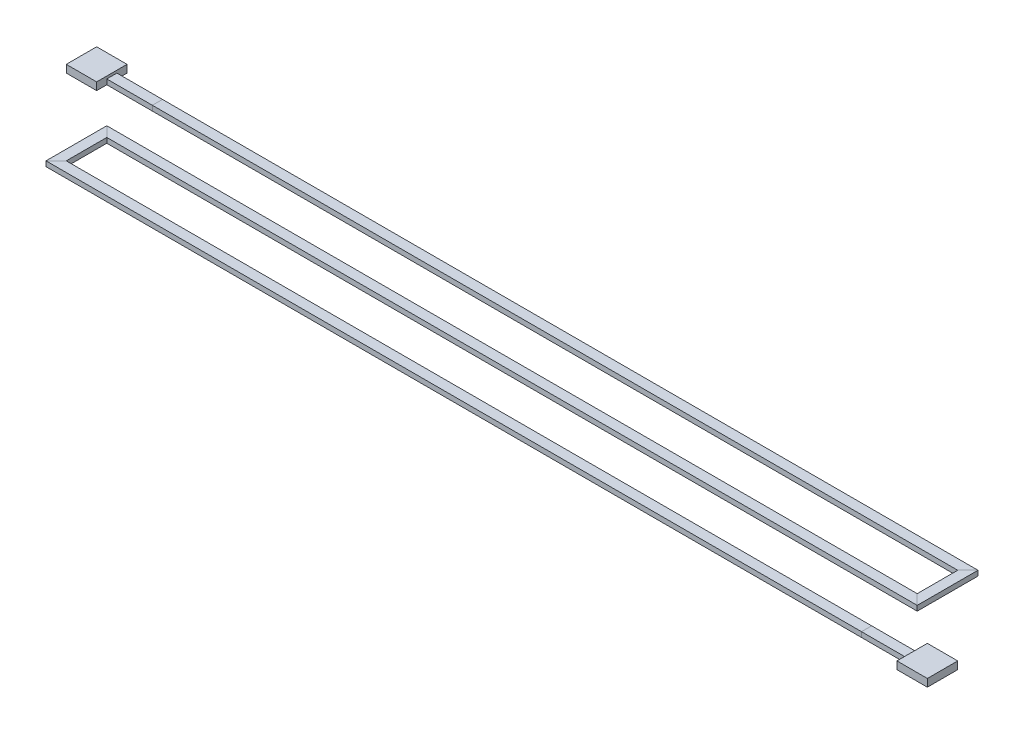
ISO-10303-21;
HEADER;
FILE_DESCRIPTION(('STEP AP214'),'2;1');
FILE_NAME('part.step','',(''),(''),'','','');
FILE_SCHEMA(('AUTOMOTIVE_DESIGN { 1 0 10303 214 1 1 1 1 }'));
ENDSEC;
DATA;
#1=APPLICATION_CONTEXT('core data for automotive mechanical design processes');
#2=APPLICATION_PROTOCOL_DEFINITION('international standard','automotive_design',2000,#1);
#3=PRODUCT_CONTEXT('',#1,'mechanical');
#4=PRODUCT('Part','Part','',(#3));
#5=PRODUCT_RELATED_PRODUCT_CATEGORY('part','',(#4));
#6=PRODUCT_DEFINITION_FORMATION('','',#4);
#7=PRODUCT_DEFINITION_CONTEXT('part definition',#1,'design');
#8=PRODUCT_DEFINITION('design','',#6,#7);
#9=PRODUCT_DEFINITION_SHAPE('','',#8);
#10=(LENGTH_UNIT() NAMED_UNIT(*) SI_UNIT(.MILLI.,.METRE.));
#11=(NAMED_UNIT(*) PLANE_ANGLE_UNIT() SI_UNIT($,.RADIAN.));
#12=(NAMED_UNIT(*) SI_UNIT($,.STERADIAN.) SOLID_ANGLE_UNIT());
#13=UNCERTAINTY_MEASURE_WITH_UNIT(LENGTH_MEASURE(1.E-05),#10,'distance_accuracy_value','');
#14=(GEOMETRIC_REPRESENTATION_CONTEXT(3) GLOBAL_UNCERTAINTY_ASSIGNED_CONTEXT((#13)) GLOBAL_UNIT_ASSIGNED_CONTEXT((#10,
#11,#12)) REPRESENTATION_CONTEXT('',''));
#15=CARTESIAN_POINT('',(0.,0.,0.));
#16=DIRECTION('',(0.,0.,1.));
#17=DIRECTION('',(1.,0.,0.));
#18=AXIS2_PLACEMENT_3D('',#15,#16,#17);
#19=CARTESIAN_POINT('',(-41.2055555555555,-0.25,4.5));
#20=DIRECTION('',(0.,0.,-1.));
#21=DIRECTION('',(-1.,0.,0.));
#22=AXIS2_PLACEMENT_3D('',#19,#20,#21);
#23=PLANE('',#22);
#24=DIRECTION('',(0.,-1.,0.));
#25=VECTOR('',#24,1.);
#26=CARTESIAN_POINT('',(-40.0555555555555,-0.25,4.5));
#27=LINE('',#26,#25);
#28=CARTESIAN_POINT('',(-40.0555555555555,0.25,4.5));
#29=VERTEX_POINT('',#28);
#30=CARTESIAN_POINT('',(-40.0555555555555,-0.25,4.5));
#31=VERTEX_POINT('',#30);
#32=EDGE_CURVE('E388',#29,#31,#27,.T.);
#33=ORIENTED_EDGE('',*,*,#32,.F.);
#34=DIRECTION('',(1.,0.,0.));
#35=VECTOR('',#34,1.);
#36=CARTESIAN_POINT('',(-41.2055555555555,0.25,4.5));
#37=LINE('',#36,#35);
#38=CARTESIAN_POINT('',(39.4444444444445,0.25,4.5));
#39=VERTEX_POINT('',#38);
#40=EDGE_CURVE('E426',#29,#39,#37,.T.);
#41=ORIENTED_EDGE('',*,*,#40,.T.);
#42=DIRECTION('',(0.,1.,0.));
#43=VECTOR('',#42,1.);
#44=CARTESIAN_POINT('',(39.4444444444445,-0.25,4.5));
#45=LINE('',#44,#43);
#46=CARTESIAN_POINT('',(39.4444444444445,-0.25,4.5));
#47=VERTEX_POINT('',#46);
#48=EDGE_CURVE('E417',#47,#39,#45,.T.);
#49=ORIENTED_EDGE('',*,*,#48,.F.);
#50=DIRECTION('',(1.,0.,0.));
#51=VECTOR('',#50,1.);
#52=CARTESIAN_POINT('',(-41.2055555555555,-0.25,4.5));
#53=LINE('',#52,#51);
#54=EDGE_CURVE('E37',#31,#47,#53,.T.);
#55=ORIENTED_EDGE('',*,*,#54,.F.);
#56=EDGE_LOOP('',(#33,#41,#49,#55));
#57=FACE_BOUND('',#56,.T.);
#58=ADVANCED_FACE('F33',(#57),#23,.T.);
#59=CARTESIAN_POINT('',(-41.2055555555555,0.25,5.5));
#60=DIRECTION('',(0.,1.,0.));
#61=DIRECTION('',(0.,0.,1.));
#62=AXIS2_PLACEMENT_3D('',#59,#60,#61);
#63=PLANE('',#62);
#64=DIRECTION('',(0.707106781186548,0.,-0.707106781186548));
#65=VECTOR('',#64,1.);
#66=CARTESIAN_POINT('',(-37.9805555555555,0.25,2.425));
#67=LINE('',#66,#65);
#68=CARTESIAN_POINT('',(-41.0555555555555,0.25,5.5));
#69=VERTEX_POINT('',#68);
#70=EDGE_CURVE('E369',#69,#29,#67,.T.);
#71=ORIENTED_EDGE('',*,*,#70,.F.);
#72=DIRECTION('',(1.,0.,0.));
#73=VECTOR('',#72,1.);
#74=CARTESIAN_POINT('',(-41.2055555555555,0.25,5.5));
#75=LINE('',#74,#73);
#76=CARTESIAN_POINT('',(39.4444444444445,0.25,5.5));
#77=VERTEX_POINT('',#76);
#78=EDGE_CURVE('E425',#69,#77,#75,.T.);
#79=ORIENTED_EDGE('',*,*,#78,.T.);
#80=DIRECTION('',(0.,0.,1.));
#81=VECTOR('',#80,1.);
#82=CARTESIAN_POINT('',(39.4444444444445,0.25,5.5));
#83=LINE('',#82,#81);
#84=EDGE_CURVE('E412',#39,#77,#83,.T.);
#85=ORIENTED_EDGE('',*,*,#84,.F.);
#86=ORIENTED_EDGE('',*,*,#40,.F.);
#87=EDGE_LOOP('',(#71,#79,#85,#86));
#88=FACE_BOUND('',#87,.T.);
#89=ADVANCED_FACE('F442',(#88),#63,.T.);
#90=CARTESIAN_POINT('',(-41.2055555555555,-0.25,5.5));
#91=DIRECTION('',(0.,0.,1.));
#92=DIRECTION('',(1.,0.,0.));
#93=AXIS2_PLACEMENT_3D('',#90,#91,#92);
#94=PLANE('',#93);
#95=DIRECTION('',(0.,1.,0.));
#96=VECTOR('',#95,1.);
#97=CARTESIAN_POINT('',(-41.0555555555555,-0.25,5.5));
#98=LINE('',#97,#96);
#99=CARTESIAN_POINT('',(-41.0555555555555,-0.25,5.5));
#100=VERTEX_POINT('',#99);
#101=EDGE_CURVE('E382',#100,#69,#98,.T.);
#102=ORIENTED_EDGE('',*,*,#101,.F.);
#103=DIRECTION('',(1.,0.,0.));
#104=VECTOR('',#103,1.);
#105=CARTESIAN_POINT('',(-41.2055555555555,-0.25,5.5));
#106=LINE('',#105,#104);
#107=CARTESIAN_POINT('',(39.4444444444445,-0.25,5.5));
#108=VERTEX_POINT('',#107);
#109=EDGE_CURVE('E423',#100,#108,#106,.T.);
#110=ORIENTED_EDGE('',*,*,#109,.T.);
#111=DIRECTION('',(0.,-1.,0.));
#112=VECTOR('',#111,1.);
#113=CARTESIAN_POINT('',(39.4444444444445,-0.25,5.5));
#114=LINE('',#113,#112);
#115=EDGE_CURVE('E406',#77,#108,#114,.T.);
#116=ORIENTED_EDGE('',*,*,#115,.F.);
#117=ORIENTED_EDGE('',*,*,#78,.F.);
#118=EDGE_LOOP('',(#102,#110,#116,#117));
#119=FACE_BOUND('',#118,.T.);
#120=ADVANCED_FACE('F448',(#119),#94,.T.);
#121=CARTESIAN_POINT('',(-41.2055555555555,-0.25,5.5));
#122=DIRECTION('',(0.,-1.,0.));
#123=DIRECTION('',(0.,0.,-1.));
#124=AXIS2_PLACEMENT_3D('',#121,#122,#123);
#125=PLANE('',#124);
#126=DIRECTION('',(-0.707106781186548,0.,0.707106781186548));
#127=VECTOR('',#126,1.);
#128=CARTESIAN_POINT('',(-37.9805555555555,-0.25,2.425));
#129=LINE('',#128,#127);
#130=EDGE_CURVE('E385',#31,#100,#129,.T.);
#131=ORIENTED_EDGE('',*,*,#130,.F.);
#132=ORIENTED_EDGE('',*,*,#54,.T.);
#133=DIRECTION('',(0.,0.,-1.));
#134=VECTOR('',#133,1.);
#135=CARTESIAN_POINT('',(39.4444444444445,-0.25,5.5));
#136=LINE('',#135,#134);
#137=EDGE_CURVE('E403',#108,#47,#136,.T.);
#138=ORIENTED_EDGE('',*,*,#137,.F.);
#139=ORIENTED_EDGE('',*,*,#109,.F.);
#140=EDGE_LOOP('',(#131,#132,#138,#139));
#141=FACE_BOUND('',#140,.T.);
#142=ADVANCED_FACE('F35',(#141),#125,.T.);
#143=CARTESIAN_POINT('',(39.4444444444445,-0.25,4.5));
#144=DIRECTION('',(0.,0.,-1.));
#145=DIRECTION('',(-1.,0.,0.));
#146=AXIS2_PLACEMENT_3D('',#143,#144,#145);
#147=PLANE('',#146);
#148=DIRECTION('',(0.,1.,0.));
#149=VECTOR('',#148,1.);
#150=CARTESIAN_POINT('',(43.9444444444445,-0.25,4.5));
#151=LINE('',#150,#149);
#152=CARTESIAN_POINT('',(43.9444444444445,-0.25,4.5));
#153=VERTEX_POINT('',#152);
#154=CARTESIAN_POINT('',(43.9444444444445,0.25,4.5));
#155=VERTEX_POINT('',#154);
#156=EDGE_CURVE('E243',#153,#155,#151,.T.);
#157=ORIENTED_EDGE('',*,*,#156,.F.);
#158=DIRECTION('',(1.,0.,0.));
#159=VECTOR('',#158,1.);
#160=CARTESIAN_POINT('',(39.4444444444445,-0.25,4.5));
#161=LINE('',#160,#159);
#162=EDGE_CURVE('E407',#47,#153,#161,.T.);
#163=ORIENTED_EDGE('',*,*,#162,.F.);
#164=ORIENTED_EDGE('',*,*,#48,.T.);
#165=DIRECTION('',(1.,0.,0.));
#166=VECTOR('',#165,1.);
#167=CARTESIAN_POINT('',(39.4444444444445,0.25,4.5));
#168=LINE('',#167,#166);
#169=EDGE_CURVE('E414',#39,#155,#168,.T.);
#170=ORIENTED_EDGE('',*,*,#169,.T.);
#171=EDGE_LOOP('',(#157,#163,#164,#170));
#172=FACE_BOUND('',#171,.T.);
#173=ADVANCED_FACE('F436',(#172),#147,.T.);
#174=CARTESIAN_POINT('',(39.4444444444445,0.25,5.5));
#175=DIRECTION('',(0.,1.,0.));
#176=DIRECTION('',(0.,0.,1.));
#177=AXIS2_PLACEMENT_3D('',#174,#175,#176);
#178=PLANE('',#177);
#179=DIRECTION('',(0.,0.,1.));
#180=VECTOR('',#179,1.);
#181=CARTESIAN_POINT('',(43.9444444444445,0.25,5.5));
#182=LINE('',#181,#180);
#183=CARTESIAN_POINT('',(43.9444444444445,0.25,5.5));
#184=VERTEX_POINT('',#183);
#185=EDGE_CURVE('E50',#155,#184,#182,.T.);
#186=ORIENTED_EDGE('',*,*,#185,.F.);
#187=ORIENTED_EDGE('',*,*,#169,.F.);
#188=ORIENTED_EDGE('',*,*,#84,.T.);
#189=DIRECTION('',(1.,0.,0.));
#190=VECTOR('',#189,1.);
#191=CARTESIAN_POINT('',(39.4444444444445,0.25,5.5));
#192=LINE('',#191,#190);
#193=EDGE_CURVE('E409',#77,#184,#192,.T.);
#194=ORIENTED_EDGE('',*,*,#193,.T.);
#195=EDGE_LOOP('',(#186,#187,#188,#194));
#196=FACE_BOUND('',#195,.T.);
#197=ADVANCED_FACE('F523',(#196),#178,.T.);
#198=CARTESIAN_POINT('',(39.4444444444445,-0.25,5.5));
#199=DIRECTION('',(0.,0.,1.));
#200=DIRECTION('',(1.,0.,0.));
#201=AXIS2_PLACEMENT_3D('',#198,#199,#200);
#202=PLANE('',#201);
#203=DIRECTION('',(0.,-1.,0.));
#204=VECTOR('',#203,1.);
#205=CARTESIAN_POINT('',(43.9444444444445,-0.25,5.5));
#206=LINE('',#205,#204);
#207=CARTESIAN_POINT('',(43.9444444444445,-0.25,5.5));
#208=VERTEX_POINT('',#207);
#209=EDGE_CURVE('E58',#184,#208,#206,.T.);
#210=ORIENTED_EDGE('',*,*,#209,.F.);
#211=ORIENTED_EDGE('',*,*,#193,.F.);
#212=ORIENTED_EDGE('',*,*,#115,.T.);
#213=DIRECTION('',(1.,0.,0.));
#214=VECTOR('',#213,1.);
#215=CARTESIAN_POINT('',(39.4444444444445,-0.25,5.5));
#216=LINE('',#215,#214);
#217=EDGE_CURVE('E289',#108,#208,#216,.T.);
#218=ORIENTED_EDGE('',*,*,#217,.T.);
#219=EDGE_LOOP('',(#210,#211,#212,#218));
#220=FACE_BOUND('',#219,.T.);
#221=ADVANCED_FACE('F520',(#220),#202,.T.);
#222=CARTESIAN_POINT('',(39.4444444444445,-0.25,5.5));
#223=DIRECTION('',(0.,-1.,0.));
#224=DIRECTION('',(0.,0.,-1.));
#225=AXIS2_PLACEMENT_3D('',#222,#223,#224);
#226=PLANE('',#225);
#227=ORIENTED_EDGE('',*,*,#162,.T.);
#228=DIRECTION('',(0.,0.,-1.));
#229=VECTOR('',#228,1.);
#230=CARTESIAN_POINT('',(43.9444444444445,-0.25,6.5));
#231=LINE('',#230,#229);
#232=CARTESIAN_POINT('',(43.9444444444445,-0.25,3.5));
#233=VERTEX_POINT('',#232);
#234=EDGE_CURVE('E233',#153,#233,#231,.T.);
#235=ORIENTED_EDGE('',*,*,#234,.T.);
#236=DIRECTION('',(1.,0.,0.));
#237=VECTOR('',#236,1.);
#238=CARTESIAN_POINT('',(43.9444444444445,-0.25,3.5));
#239=LINE('',#238,#237);
#240=CARTESIAN_POINT('',(46.9444444444445,-0.25,3.5));
#241=VERTEX_POINT('',#240);
#242=EDGE_CURVE('E222',#233,#241,#239,.T.);
#243=ORIENTED_EDGE('',*,*,#242,.T.);
#244=DIRECTION('',(0.,0.,1.));
#245=VECTOR('',#244,1.);
#246=CARTESIAN_POINT('',(46.9444444444445,-0.25,6.5));
#247=LINE('',#246,#245);
#248=CARTESIAN_POINT('',(46.9444444444445,-0.25,6.5));
#249=VERTEX_POINT('',#248);
#250=EDGE_CURVE('E230',#241,#249,#247,.T.);
#251=ORIENTED_EDGE('',*,*,#250,.T.);
#252=DIRECTION('',(-1.,0.,0.));
#253=VECTOR('',#252,1.);
#254=CARTESIAN_POINT('',(43.9444444444445,-0.25,6.5));
#255=LINE('',#254,#253);
#256=CARTESIAN_POINT('',(43.9444444444445,-0.25,6.5));
#257=VERTEX_POINT('',#256);
#258=EDGE_CURVE('E202',#249,#257,#255,.T.);
#259=ORIENTED_EDGE('',*,*,#258,.T.);
#260=EDGE_CURVE('E225',#257,#208,#231,.T.);
#261=ORIENTED_EDGE('',*,*,#260,.T.);
#262=ORIENTED_EDGE('',*,*,#217,.F.);
#263=ORIENTED_EDGE('',*,*,#137,.T.);
#264=EDGE_LOOP('',(#227,#235,#243,#251,#259,#261,#262,#263));
#265=FACE_BOUND('',#264,.T.);
#266=ADVANCED_FACE('F440',(#265),#226,.T.);
#267=CARTESIAN_POINT('',(-41.0555555555555,-0.25,-0.650000000000005));
#268=DIRECTION('',(0.,-1.,0.));
#269=DIRECTION('',(0.,0.,-1.));
#270=AXIS2_PLACEMENT_3D('',#267,#268,#269);
#271=PLANE('',#270);
#272=DIRECTION('',(0.,0.,1.));
#273=VECTOR('',#272,1.);
#274=CARTESIAN_POINT('',(-40.0555555555555,-0.25,-0.650000000000005));
#275=LINE('',#274,#273);
#276=CARTESIAN_POINT('',(-40.0555555555555,-0.25,0.500000000000002));
#277=VERTEX_POINT('',#276);
#278=EDGE_CURVE('E398',#277,#31,#275,.T.);
#279=ORIENTED_EDGE('',*,*,#278,.T.);
#280=ORIENTED_EDGE('',*,*,#130,.T.);
#281=DIRECTION('',(0.,0.,1.));
#282=VECTOR('',#281,1.);
#283=CARTESIAN_POINT('',(-41.0555555555555,-0.25,-0.650000000000005));
#284=LINE('',#283,#282);
#285=CARTESIAN_POINT('',(-41.0555555555555,-0.25,-0.499999999999999));
#286=VERTEX_POINT('',#285);
#287=EDGE_CURVE('E389',#286,#100,#284,.T.);
#288=ORIENTED_EDGE('',*,*,#287,.F.);
#289=DIRECTION('',(-0.707106781186548,0.,-0.707106781186548));
#290=VECTOR('',#289,1.);
#291=CARTESIAN_POINT('',(-0.48055555555554,-0.25,40.075));
#292=LINE('',#291,#290);
#293=EDGE_CURVE('E361',#277,#286,#292,.T.);
#294=ORIENTED_EDGE('',*,*,#293,.F.);
#295=EDGE_LOOP('',(#279,#280,#288,#294));
#296=FACE_BOUND('',#295,.T.);
#297=ADVANCED_FACE('F513',(#296),#271,.T.);
#298=CARTESIAN_POINT('',(-41.0555555555555,-0.25,-0.650000000000005));
#299=DIRECTION('',(-1.,0.,0.));
#300=DIRECTION('',(0.,0.,1.));
#301=AXIS2_PLACEMENT_3D('',#298,#299,#300);
#302=PLANE('',#301);
#303=ORIENTED_EDGE('',*,*,#287,.T.);
#304=ORIENTED_EDGE('',*,*,#101,.T.);
#305=DIRECTION('',(0.,0.,1.));
#306=VECTOR('',#305,1.);
#307=CARTESIAN_POINT('',(-41.0555555555555,0.25,-0.650000000000005));
#308=LINE('',#307,#306);
#309=CARTESIAN_POINT('',(-41.0555555555555,0.25,-0.499999999999998));
#310=VERTEX_POINT('',#309);
#311=EDGE_CURVE('E392',#310,#69,#308,.T.);
#312=ORIENTED_EDGE('',*,*,#311,.F.);
#313=DIRECTION('',(0.,1.,0.));
#314=VECTOR('',#313,1.);
#315=CARTESIAN_POINT('',(-41.0555555555555,-0.25,-0.499999999999997));
#316=LINE('',#315,#314);
#317=EDGE_CURVE('E358',#286,#310,#316,.T.);
#318=ORIENTED_EDGE('',*,*,#317,.F.);
#319=EDGE_LOOP('',(#303,#304,#312,#318));
#320=FACE_BOUND('',#319,.T.);
#321=ADVANCED_FACE('F509',(#320),#302,.T.);
#322=CARTESIAN_POINT('',(-41.0555555555555,0.25,-0.650000000000005));
#323=DIRECTION('',(0.,1.,0.));
#324=DIRECTION('',(0.,0.,1.));
#325=AXIS2_PLACEMENT_3D('',#322,#323,#324);
#326=PLANE('',#325);
#327=ORIENTED_EDGE('',*,*,#311,.T.);
#328=ORIENTED_EDGE('',*,*,#70,.T.);
#329=DIRECTION('',(0.,0.,1.));
#330=VECTOR('',#329,1.);
#331=CARTESIAN_POINT('',(-40.0555555555555,0.25,-0.650000000000005));
#332=LINE('',#331,#330);
#333=CARTESIAN_POINT('',(-40.0555555555555,0.25,0.500000000000002));
#334=VERTEX_POINT('',#333);
#335=EDGE_CURVE('E395',#334,#29,#332,.T.);
#336=ORIENTED_EDGE('',*,*,#335,.F.);
#337=DIRECTION('',(0.707106781186548,0.,0.707106781186548));
#338=VECTOR('',#337,1.);
#339=CARTESIAN_POINT('',(-0.48055555555554,0.25,40.075));
#340=LINE('',#339,#338);
#341=EDGE_CURVE('E345',#310,#334,#340,.T.);
#342=ORIENTED_EDGE('',*,*,#341,.F.);
#343=EDGE_LOOP('',(#327,#328,#336,#342));
#344=FACE_BOUND('',#343,.T.);
#345=ADVANCED_FACE('F505',(#344),#326,.T.);
#346=CARTESIAN_POINT('',(-40.0555555555555,-0.25,-0.650000000000005));
#347=DIRECTION('',(1.,0.,0.));
#348=DIRECTION('',(0.,0.,-1.));
#349=AXIS2_PLACEMENT_3D('',#346,#347,#348);
#350=PLANE('',#349);
#351=ORIENTED_EDGE('',*,*,#335,.T.);
#352=ORIENTED_EDGE('',*,*,#32,.T.);
#353=ORIENTED_EDGE('',*,*,#278,.F.);
#354=DIRECTION('',(0.,-1.,0.));
#355=VECTOR('',#354,1.);
#356=CARTESIAN_POINT('',(-40.0555555555555,-0.25,0.500000000000003));
#357=LINE('',#356,#355);
#358=EDGE_CURVE('E364',#334,#277,#357,.T.);
#359=ORIENTED_EDGE('',*,*,#358,.F.);
#360=EDGE_LOOP('',(#351,#352,#353,#359));
#361=FACE_BOUND('',#360,.T.);
#362=ADVANCED_FACE('F501',(#361),#350,.T.);
#363=CARTESIAN_POINT('',(40.0944444444445,-0.25,-0.499999999999997));
#364=DIRECTION('',(0.,-1.,0.));
#365=DIRECTION('',(0.,0.,-1.));
#366=AXIS2_PLACEMENT_3D('',#363,#364,#365);
#367=PLANE('',#366);
#368=DIRECTION('',(-1.,0.,0.));
#369=VECTOR('',#368,1.);
#370=CARTESIAN_POINT('',(40.0944444444445,-0.25,0.500000000000003));
#371=LINE('',#370,#369);
#372=CARTESIAN_POINT('',(39.9444444444445,-0.25,0.500000000000002));
#373=VERTEX_POINT('',#372);
#374=EDGE_CURVE('E375',#373,#277,#371,.T.);
#375=ORIENTED_EDGE('',*,*,#374,.T.);
#376=ORIENTED_EDGE('',*,*,#293,.T.);
#377=DIRECTION('',(-1.,0.,0.));
#378=VECTOR('',#377,1.);
#379=CARTESIAN_POINT('',(40.0944444444445,-0.25,-0.499999999999997));
#380=LINE('',#379,#378);
#381=CARTESIAN_POINT('',(38.9444444444445,-0.25,-0.499999999999999));
#382=VERTEX_POINT('',#381);
#383=EDGE_CURVE('E365',#382,#286,#380,.T.);
#384=ORIENTED_EDGE('',*,*,#383,.F.);
#385=DIRECTION('',(-0.707106781186548,0.,-0.707106781186548));
#386=VECTOR('',#385,1.);
#387=CARTESIAN_POINT('',(36.3694444444445,-0.25,-3.075));
#388=LINE('',#387,#386);
#389=EDGE_CURVE('E337',#373,#382,#388,.T.);
#390=ORIENTED_EDGE('',*,*,#389,.F.);
#391=EDGE_LOOP('',(#375,#376,#384,#390));
#392=FACE_BOUND('',#391,.T.);
#393=ADVANCED_FACE('F497',(#392),#367,.T.);
#394=CARTESIAN_POINT('',(40.0944444444445,-0.25,-0.499999999999997));
#395=DIRECTION('',(0.,0.,-1.));
#396=DIRECTION('',(-1.,0.,0.));
#397=AXIS2_PLACEMENT_3D('',#394,#395,#396);
#398=PLANE('',#397);
#399=ORIENTED_EDGE('',*,*,#383,.T.);
#400=ORIENTED_EDGE('',*,*,#317,.T.);
#401=DIRECTION('',(-1.,0.,0.));
#402=VECTOR('',#401,1.);
#403=CARTESIAN_POINT('',(40.0944444444445,0.25,-0.499999999999997));
#404=LINE('',#403,#402);
#405=CARTESIAN_POINT('',(38.9444444444445,0.25,-0.499999999999999));
#406=VERTEX_POINT('',#405);
#407=EDGE_CURVE('E368',#406,#310,#404,.T.);
#408=ORIENTED_EDGE('',*,*,#407,.F.);
#409=DIRECTION('',(0.,1.,0.));
#410=VECTOR('',#409,1.);
#411=CARTESIAN_POINT('',(38.9444444444445,-0.25,-0.5));
#412=LINE('',#411,#410);
#413=EDGE_CURVE('E334',#382,#406,#412,.T.);
#414=ORIENTED_EDGE('',*,*,#413,.F.);
#415=EDGE_LOOP('',(#399,#400,#408,#414));
#416=FACE_BOUND('',#415,.T.);
#417=ADVANCED_FACE('F493',(#416),#398,.T.);
#418=CARTESIAN_POINT('',(40.0944444444445,0.25,-0.499999999999997));
#419=DIRECTION('',(0.,1.,0.));
#420=DIRECTION('',(0.,0.,1.));
#421=AXIS2_PLACEMENT_3D('',#418,#419,#420);
#422=PLANE('',#421);
#423=ORIENTED_EDGE('',*,*,#407,.T.);
#424=ORIENTED_EDGE('',*,*,#341,.T.);
#425=DIRECTION('',(-1.,0.,0.));
#426=VECTOR('',#425,1.);
#427=CARTESIAN_POINT('',(40.0944444444445,0.25,0.500000000000003));
#428=LINE('',#427,#426);
#429=CARTESIAN_POINT('',(39.9444444444445,0.25,0.500000000000002));
#430=VERTEX_POINT('',#429);
#431=EDGE_CURVE('E372',#430,#334,#428,.T.);
#432=ORIENTED_EDGE('',*,*,#431,.F.);
#433=DIRECTION('',(0.707106781186548,0.,0.707106781186548));
#434=VECTOR('',#433,1.);
#435=CARTESIAN_POINT('',(36.3694444444445,0.25,-3.075));
#436=LINE('',#435,#434);
#437=EDGE_CURVE('E321',#406,#430,#436,.T.);
#438=ORIENTED_EDGE('',*,*,#437,.F.);
#439=EDGE_LOOP('',(#423,#424,#432,#438));
#440=FACE_BOUND('',#439,.T.);
#441=ADVANCED_FACE('F489',(#440),#422,.T.);
#442=CARTESIAN_POINT('',(40.0944444444445,-0.25,0.500000000000003));
#443=DIRECTION('',(0.,0.,1.));
#444=DIRECTION('',(1.,0.,0.));
#445=AXIS2_PLACEMENT_3D('',#442,#443,#444);
#446=PLANE('',#445);
#447=ORIENTED_EDGE('',*,*,#431,.T.);
#448=ORIENTED_EDGE('',*,*,#358,.T.);
#449=ORIENTED_EDGE('',*,*,#374,.F.);
#450=DIRECTION('',(0.,-1.,0.));
#451=VECTOR('',#450,1.);
#452=CARTESIAN_POINT('',(39.9444444444445,-0.25,0.500000000000001));
#453=LINE('',#452,#451);
#454=EDGE_CURVE('E340',#430,#373,#453,.T.);
#455=ORIENTED_EDGE('',*,*,#454,.F.);
#456=EDGE_LOOP('',(#447,#448,#449,#455));
#457=FACE_BOUND('',#456,.T.);
#458=ADVANCED_FACE('F485',(#457),#446,.T.);
#459=CARTESIAN_POINT('',(38.9444444444445,-0.25,-5.65));
#460=DIRECTION('',(0.,-1.,0.));
#461=DIRECTION('',(0.,0.,-1.));
#462=AXIS2_PLACEMENT_3D('',#459,#460,#461);
#463=PLANE('',#462);
#464=DIRECTION('',(0.,0.,1.));
#465=VECTOR('',#464,1.);
#466=CARTESIAN_POINT('',(39.9444444444445,-0.25,-5.65));
#467=LINE('',#466,#465);
#468=CARTESIAN_POINT('',(39.9444444444445,-0.25,-5.5));
#469=VERTEX_POINT('',#468);
#470=EDGE_CURVE('E351',#469,#373,#467,.T.);
#471=ORIENTED_EDGE('',*,*,#470,.T.);
#472=ORIENTED_EDGE('',*,*,#389,.T.);
#473=DIRECTION('',(0.,0.,1.));
#474=VECTOR('',#473,1.);
#475=CARTESIAN_POINT('',(38.9444444444445,-0.25,-5.65));
#476=LINE('',#475,#474);
#477=CARTESIAN_POINT('',(38.9444444444445,-0.25,-4.5));
#478=VERTEX_POINT('',#477);
#479=EDGE_CURVE('E341',#478,#382,#476,.T.);
#480=ORIENTED_EDGE('',*,*,#479,.F.);
#481=DIRECTION('',(-0.707106781186547,0.,0.707106781186548));
#482=VECTOR('',#481,1.);
#483=CARTESIAN_POINT('',(-0.805555555555538,-0.25,35.25));
#484=LINE('',#483,#482);
#485=EDGE_CURVE('E312',#469,#478,#484,.T.);
#486=ORIENTED_EDGE('',*,*,#485,.F.);
#487=EDGE_LOOP('',(#471,#472,#480,#486));
#488=FACE_BOUND('',#487,.T.);
#489=ADVANCED_FACE('F481',(#488),#463,.T.);
#490=CARTESIAN_POINT('',(38.9444444444445,-0.25,-5.65));
#491=DIRECTION('',(-1.,0.,0.));
#492=DIRECTION('',(0.,0.,1.));
#493=AXIS2_PLACEMENT_3D('',#490,#491,#492);
#494=PLANE('',#493);
#495=ORIENTED_EDGE('',*,*,#479,.T.);
#496=ORIENTED_EDGE('',*,*,#413,.T.);
#497=DIRECTION('',(0.,0.,1.));
#498=VECTOR('',#497,1.);
#499=CARTESIAN_POINT('',(38.9444444444445,0.25,-5.65));
#500=LINE('',#499,#498);
#501=CARTESIAN_POINT('',(38.9444444444445,0.25,-4.5));
#502=VERTEX_POINT('',#501);
#503=EDGE_CURVE('E344',#502,#406,#500,.T.);
#504=ORIENTED_EDGE('',*,*,#503,.F.);
#505=DIRECTION('',(0.,1.,0.));
#506=VECTOR('',#505,1.);
#507=CARTESIAN_POINT('',(38.9444444444445,-0.25,-4.5));
#508=LINE('',#507,#506);
#509=EDGE_CURVE('E315',#478,#502,#508,.T.);
#510=ORIENTED_EDGE('',*,*,#509,.F.);
#511=EDGE_LOOP('',(#495,#496,#504,#510));
#512=FACE_BOUND('',#511,.T.);
#513=ADVANCED_FACE('F477',(#512),#494,.T.);
#514=CARTESIAN_POINT('',(38.9444444444445,0.25,-5.65));
#515=DIRECTION('',(0.,1.,0.));
#516=DIRECTION('',(0.,0.,1.));
#517=AXIS2_PLACEMENT_3D('',#514,#515,#516);
#518=PLANE('',#517);
#519=ORIENTED_EDGE('',*,*,#503,.T.);
#520=ORIENTED_EDGE('',*,*,#437,.T.);
#521=DIRECTION('',(0.,0.,1.));
#522=VECTOR('',#521,1.);
#523=CARTESIAN_POINT('',(39.9444444444445,0.25,-5.65));
#524=LINE('',#523,#522);
#525=CARTESIAN_POINT('',(39.9444444444445,0.25,-5.5));
#526=VERTEX_POINT('',#525);
#527=EDGE_CURVE('E348',#526,#430,#524,.T.);
#528=ORIENTED_EDGE('',*,*,#527,.F.);
#529=DIRECTION('',(0.707106781186547,0.,-0.707106781186548));
#530=VECTOR('',#529,1.);
#531=CARTESIAN_POINT('',(-0.805555555555538,0.25,35.25));
#532=LINE('',#531,#530);
#533=EDGE_CURVE('E318',#502,#526,#532,.T.);
#534=ORIENTED_EDGE('',*,*,#533,.F.);
#535=EDGE_LOOP('',(#519,#520,#528,#534));
#536=FACE_BOUND('',#535,.T.);
#537=ADVANCED_FACE('F473',(#536),#518,.T.);
#538=CARTESIAN_POINT('',(39.9444444444445,-0.25,-5.65));
#539=DIRECTION('',(1.,0.,0.));
#540=DIRECTION('',(0.,0.,-1.));
#541=AXIS2_PLACEMENT_3D('',#538,#539,#540);
#542=PLANE('',#541);
#543=ORIENTED_EDGE('',*,*,#527,.T.);
#544=ORIENTED_EDGE('',*,*,#454,.T.);
#545=ORIENTED_EDGE('',*,*,#470,.F.);
#546=DIRECTION('',(0.,-1.,0.));
#547=VECTOR('',#546,1.);
#548=CARTESIAN_POINT('',(39.9444444444445,-0.25,-5.5));
#549=LINE('',#548,#547);
#550=EDGE_CURVE('E308',#526,#469,#549,.T.);
#551=ORIENTED_EDGE('',*,*,#550,.F.);
#552=EDGE_LOOP('',(#543,#544,#545,#551));
#553=FACE_BOUND('',#552,.T.);
#554=ADVANCED_FACE('F469',(#553),#542,.T.);
#555=CARTESIAN_POINT('',(-46.5555555555555,-0.25,-5.49999999999999));
#556=DIRECTION('',(0.,0.,-1.));
#557=DIRECTION('',(-1.,0.,0.));
#558=AXIS2_PLACEMENT_3D('',#555,#556,#557);
#559=PLANE('',#558);
#560=DIRECTION('',(0.,-1.,0.));
#561=VECTOR('',#560,1.);
#562=CARTESIAN_POINT('',(-45.0555555555555,-0.25,-5.49999999999999));
#563=LINE('',#562,#561);
#564=CARTESIAN_POINT('',(-45.0555555555555,0.25,-5.49999999999999));
#565=VERTEX_POINT('',#564);
#566=CARTESIAN_POINT('',(-45.0555555555555,-0.25,-5.49999999999999));
#567=VERTEX_POINT('',#566);
#568=EDGE_CURVE('E286',#565,#567,#563,.T.);
#569=ORIENTED_EDGE('',*,*,#568,.F.);
#570=DIRECTION('',(1.,0.,0.));
#571=VECTOR('',#570,1.);
#572=CARTESIAN_POINT('',(-46.5555555555555,0.25,-5.49999999999999));
#573=LINE('',#572,#571);
#574=CARTESIAN_POINT('',(-40.5555555555555,0.25,-5.49999999999999));
#575=VERTEX_POINT('',#574);
#576=EDGE_CURVE('E303',#565,#575,#573,.T.);
#577=ORIENTED_EDGE('',*,*,#576,.T.);
#578=DIRECTION('',(0.,1.,0.));
#579=VECTOR('',#578,1.);
#580=CARTESIAN_POINT('',(-40.5555555555555,-0.25,-5.49999999999999));
#581=LINE('',#580,#579);
#582=CARTESIAN_POINT('',(-40.5555555555555,-0.25,-5.49999999999999));
#583=VERTEX_POINT('',#582);
#584=EDGE_CURVE('E42',#583,#575,#581,.T.);
#585=ORIENTED_EDGE('',*,*,#584,.F.);
#586=DIRECTION('',(1.,0.,0.));
#587=VECTOR('',#586,1.);
#588=CARTESIAN_POINT('',(-46.5555555555555,-0.25,-5.49999999999999));
#589=LINE('',#588,#587);
#590=EDGE_CURVE('E11',#567,#583,#589,.T.);
#591=ORIENTED_EDGE('',*,*,#590,.F.);
#592=EDGE_LOOP('',(#569,#577,#585,#591));
#593=FACE_BOUND('',#592,.T.);
#594=ADVANCED_FACE('F472',(#593),#559,.T.);
#595=CARTESIAN_POINT('',(-46.5555555555555,0.25,-4.49999999999999));
#596=DIRECTION('',(0.,1.,0.));
#597=DIRECTION('',(0.,0.,1.));
#598=AXIS2_PLACEMENT_3D('',#595,#596,#597);
#599=PLANE('',#598);
#600=DIRECTION('',(0.,0.,-1.));
#601=VECTOR('',#600,1.);
#602=CARTESIAN_POINT('',(-45.0555555555555,0.25,-4.49999999999999));
#603=LINE('',#602,#601);
#604=CARTESIAN_POINT('',(-45.0555555555555,0.25,-4.49999999999999));
#605=VERTEX_POINT('',#604);
#606=EDGE_CURVE('E283',#605,#565,#603,.T.);
#607=ORIENTED_EDGE('',*,*,#606,.F.);
#608=DIRECTION('',(1.,0.,0.));
#609=VECTOR('',#608,1.);
#610=CARTESIAN_POINT('',(-46.5555555555555,0.25,-4.49999999999999));
#611=LINE('',#610,#609);
#612=CARTESIAN_POINT('',(-40.5555555555555,0.25,-4.49999999999999));
#613=VERTEX_POINT('',#612);
#614=EDGE_CURVE('E299',#605,#613,#611,.T.);
#615=ORIENTED_EDGE('',*,*,#614,.T.);
#616=DIRECTION('',(0.,0.,1.));
#617=VECTOR('',#616,1.);
#618=CARTESIAN_POINT('',(-40.5555555555555,0.25,-4.49999999999999));
#619=LINE('',#618,#617);
#620=EDGE_CURVE('E301',#575,#613,#619,.T.);
#621=ORIENTED_EDGE('',*,*,#620,.F.);
#622=ORIENTED_EDGE('',*,*,#576,.F.);
#623=EDGE_LOOP('',(#607,#615,#621,#622));
#624=FACE_BOUND('',#623,.T.);
#625=ADVANCED_FACE('F559',(#624),#599,.T.);
#626=CARTESIAN_POINT('',(-46.5555555555555,-0.25,-4.49999999999999));
#627=DIRECTION('',(0.,0.,1.));
#628=DIRECTION('',(1.,0.,0.));
#629=AXIS2_PLACEMENT_3D('',#626,#627,#628);
#630=PLANE('',#629);
#631=DIRECTION('',(0.,1.,0.));
#632=VECTOR('',#631,1.);
#633=CARTESIAN_POINT('',(-45.0555555555555,-0.25,-4.49999999999999));
#634=LINE('',#633,#632);
#635=CARTESIAN_POINT('',(-45.0555555555555,-0.25,-4.49999999999999));
#636=VERTEX_POINT('',#635);
#637=EDGE_CURVE('E274',#636,#605,#634,.T.);
#638=ORIENTED_EDGE('',*,*,#637,.F.);
#639=DIRECTION('',(1.,0.,0.));
#640=VECTOR('',#639,1.);
#641=CARTESIAN_POINT('',(-46.5555555555555,-0.25,-4.49999999999999));
#642=LINE('',#641,#640);
#643=CARTESIAN_POINT('',(-40.5555555555555,-0.25,-4.49999999999999));
#644=VERTEX_POINT('',#643);
#645=EDGE_CURVE('E293',#636,#644,#642,.T.);
#646=ORIENTED_EDGE('',*,*,#645,.T.);
#647=DIRECTION('',(0.,-1.,0.));
#648=VECTOR('',#647,1.);
#649=CARTESIAN_POINT('',(-40.5555555555555,-0.25,-4.49999999999999));
#650=LINE('',#649,#648);
#651=EDGE_CURVE('E296',#613,#644,#650,.T.);
#652=ORIENTED_EDGE('',*,*,#651,.F.);
#653=ORIENTED_EDGE('',*,*,#614,.F.);
#654=EDGE_LOOP('',(#638,#646,#652,#653));
#655=FACE_BOUND('',#654,.T.);
#656=ADVANCED_FACE('F565',(#655),#630,.T.);
#657=CARTESIAN_POINT('',(-46.5555555555555,-0.25,-4.49999999999999));
#658=DIRECTION('',(0.,-1.,0.));
#659=DIRECTION('',(0.,0.,-1.));
#660=AXIS2_PLACEMENT_3D('',#657,#658,#659);
#661=PLANE('',#660);
#662=DIRECTION('',(0.,0.,1.));
#663=VECTOR('',#662,1.);
#664=CARTESIAN_POINT('',(-45.0555555555555,-0.25,-3.49999999999999));
#665=LINE('',#664,#663);
#666=CARTESIAN_POINT('',(-45.0555555555555,-0.25,-6.49999999999999));
#667=VERTEX_POINT('',#666);
#668=EDGE_CURVE('E261',#667,#567,#665,.T.);
#669=ORIENTED_EDGE('',*,*,#668,.T.);
#670=ORIENTED_EDGE('',*,*,#590,.T.);
#671=DIRECTION('',(0.,0.,-1.));
#672=VECTOR('',#671,1.);
#673=CARTESIAN_POINT('',(-40.5555555555555,-0.25,-4.49999999999999));
#674=LINE('',#673,#672);
#675=EDGE_CURVE('E290',#644,#583,#674,.T.);
#676=ORIENTED_EDGE('',*,*,#675,.F.);
#677=ORIENTED_EDGE('',*,*,#645,.F.);
#678=CARTESIAN_POINT('',(-45.0555555555555,-0.25,-3.49999999999999));
#679=VERTEX_POINT('',#678);
#680=EDGE_CURVE('E246',#636,#679,#665,.T.);
#681=ORIENTED_EDGE('',*,*,#680,.T.);
#682=DIRECTION('',(-1.,0.,0.));
#683=VECTOR('',#682,1.);
#684=CARTESIAN_POINT('',(-48.0555555555555,-0.25,-3.49999999999999));
#685=LINE('',#684,#683);
#686=CARTESIAN_POINT('',(-48.0555555555555,-0.25,-3.49999999999999));
#687=VERTEX_POINT('',#686);
#688=EDGE_CURVE('E264',#679,#687,#685,.T.);
#689=ORIENTED_EDGE('',*,*,#688,.T.);
#690=DIRECTION('',(0.,0.,-1.));
#691=VECTOR('',#690,1.);
#692=CARTESIAN_POINT('',(-48.0555555555555,-0.25,-3.49999999999999));
#693=LINE('',#692,#691);
#694=CARTESIAN_POINT('',(-48.0555555555555,-0.25,-6.49999999999999));
#695=VERTEX_POINT('',#694);
#696=EDGE_CURVE('E267',#687,#695,#693,.T.);
#697=ORIENTED_EDGE('',*,*,#696,.T.);
#698=DIRECTION('',(1.,0.,0.));
#699=VECTOR('',#698,1.);
#700=CARTESIAN_POINT('',(-48.0555555555555,-0.25,-6.49999999999999));
#701=LINE('',#700,#699);
#702=EDGE_CURVE('E251',#695,#667,#701,.T.);
#703=ORIENTED_EDGE('',*,*,#702,.T.);
#704=EDGE_LOOP('',(#669,#670,#676,#677,#681,#689,#697,#703));
#705=FACE_BOUND('',#704,.T.);
#706=ADVANCED_FACE('F567',(#705),#661,.T.);
#707=CARTESIAN_POINT('',(-40.5555555555555,-0.25,-5.49999999999998));
#708=DIRECTION('',(0.,0.,-1.));
#709=DIRECTION('',(-1.,0.,0.));
#710=AXIS2_PLACEMENT_3D('',#707,#708,#709);
#711=PLANE('',#710);
#712=DIRECTION('',(1.,0.,0.));
#713=VECTOR('',#712,1.);
#714=CARTESIAN_POINT('',(-40.5555555555555,0.25,-5.49999999999998));
#715=LINE('',#714,#713);
#716=EDGE_CURVE('E327',#575,#526,#715,.T.);
#717=ORIENTED_EDGE('',*,*,#716,.T.);
#718=ORIENTED_EDGE('',*,*,#550,.T.);
#719=DIRECTION('',(1.,0.,0.));
#720=VECTOR('',#719,1.);
#721=CARTESIAN_POINT('',(-40.5555555555555,-0.25,-5.49999999999998));
#722=LINE('',#721,#720);
#723=EDGE_CURVE('E294',#583,#469,#722,.T.);
#724=ORIENTED_EDGE('',*,*,#723,.F.);
#725=ORIENTED_EDGE('',*,*,#584,.T.);
#726=EDGE_LOOP('',(#717,#718,#724,#725));
#727=FACE_BOUND('',#726,.T.);
#728=ADVANCED_FACE('F548',(#727),#711,.T.);
#729=CARTESIAN_POINT('',(-40.5555555555555,0.25,-4.49999999999998));
#730=DIRECTION('',(0.,1.,0.));
#731=DIRECTION('',(0.,0.,1.));
#732=AXIS2_PLACEMENT_3D('',#729,#730,#731);
#733=PLANE('',#732);
#734=DIRECTION('',(1.,0.,0.));
#735=VECTOR('',#734,1.);
#736=CARTESIAN_POINT('',(-40.5555555555555,0.25,-4.49999999999998));
#737=LINE('',#736,#735);
#738=EDGE_CURVE('E324',#613,#502,#737,.T.);
#739=ORIENTED_EDGE('',*,*,#738,.T.);
#740=ORIENTED_EDGE('',*,*,#533,.T.);
#741=ORIENTED_EDGE('',*,*,#716,.F.);
#742=ORIENTED_EDGE('',*,*,#620,.T.);
#743=EDGE_LOOP('',(#739,#740,#741,#742));
#744=FACE_BOUND('',#743,.T.);
#745=ADVANCED_FACE('F464',(#744),#733,.T.);
#746=CARTESIAN_POINT('',(-40.5555555555555,-0.25,-4.49999999999998));
#747=DIRECTION('',(0.,0.,1.));
#748=DIRECTION('',(1.,0.,0.));
#749=AXIS2_PLACEMENT_3D('',#746,#747,#748);
#750=PLANE('',#749);
#751=DIRECTION('',(1.,0.,0.));
#752=VECTOR('',#751,1.);
#753=CARTESIAN_POINT('',(-40.5555555555555,-0.25,-4.49999999999998));
#754=LINE('',#753,#752);
#755=EDGE_CURVE('E311',#644,#478,#754,.T.);
#756=ORIENTED_EDGE('',*,*,#755,.T.);
#757=ORIENTED_EDGE('',*,*,#509,.T.);
#758=ORIENTED_EDGE('',*,*,#738,.F.);
#759=ORIENTED_EDGE('',*,*,#651,.T.);
#760=EDGE_LOOP('',(#756,#757,#758,#759));
#761=FACE_BOUND('',#760,.T.);
#762=ADVANCED_FACE('F458',(#761),#750,.T.);
#763=CARTESIAN_POINT('',(-40.5555555555555,-0.25,-4.49999999999998));
#764=DIRECTION('',(0.,-1.,0.));
#765=DIRECTION('',(0.,0.,-1.));
#766=AXIS2_PLACEMENT_3D('',#763,#764,#765);
#767=PLANE('',#766);
#768=ORIENTED_EDGE('',*,*,#723,.T.);
#769=ORIENTED_EDGE('',*,*,#485,.T.);
#770=ORIENTED_EDGE('',*,*,#755,.F.);
#771=ORIENTED_EDGE('',*,*,#675,.T.);
#772=EDGE_LOOP('',(#768,#769,#770,#771));
#773=FACE_BOUND('',#772,.T.);
#774=ADVANCED_FACE('F454',(#773),#767,.T.);
#775=CARTESIAN_POINT('',(-45.0555555555555,0.5,-3.49999999999999));
#776=DIRECTION('',(1.,0.,0.));
#777=DIRECTION('',(0.,0.,-1.));
#778=AXIS2_PLACEMENT_3D('',#775,#776,#777);
#779=PLANE('',#778);
#780=ORIENTED_EDGE('',*,*,#606,.T.);
#781=ORIENTED_EDGE('',*,*,#568,.T.);
#782=ORIENTED_EDGE('',*,*,#668,.F.);
#783=DIRECTION('',(0.,-1.,0.));
#784=VECTOR('',#783,1.);
#785=CARTESIAN_POINT('',(-45.0555555555555,0.5,-6.49999999999999));
#786=LINE('',#785,#784);
#787=CARTESIAN_POINT('',(-45.0555555555555,0.5,-6.49999999999999));
#788=VERTEX_POINT('',#787);
#789=EDGE_CURVE('E272',#788,#667,#786,.T.);
#790=ORIENTED_EDGE('',*,*,#789,.F.);
#791=DIRECTION('',(0.,0.,1.));
#792=VECTOR('',#791,1.);
#793=CARTESIAN_POINT('',(-45.0555555555555,0.5,-3.49999999999999));
#794=LINE('',#793,#792);
#795=CARTESIAN_POINT('',(-45.0555555555555,0.5,-3.49999999999999));
#796=VERTEX_POINT('',#795);
#797=EDGE_CURVE('E247',#788,#796,#794,.T.);
#798=ORIENTED_EDGE('',*,*,#797,.T.);
#799=DIRECTION('',(0.,-1.,0.));
#800=VECTOR('',#799,1.);
#801=CARTESIAN_POINT('',(-45.0555555555555,0.5,-3.49999999999999));
#802=LINE('',#801,#800);
#803=EDGE_CURVE('E260',#796,#679,#802,.T.);
#804=ORIENTED_EDGE('',*,*,#803,.T.);
#805=ORIENTED_EDGE('',*,*,#680,.F.);
#806=ORIENTED_EDGE('',*,*,#637,.T.);
#807=EDGE_LOOP('',(#780,#781,#782,#790,#798,#804,#805,#806));
#808=FACE_BOUND('',#807,.T.);
#809=ADVANCED_FACE('F444',(#808),#779,.T.);
#810=CARTESIAN_POINT('',(-48.0555555555555,0.5,-6.49999999999999));
#811=DIRECTION('',(0.,0.,-1.));
#812=DIRECTION('',(-1.,0.,0.));
#813=AXIS2_PLACEMENT_3D('',#810,#811,#812);
#814=PLANE('',#813);
#815=ORIENTED_EDGE('',*,*,#702,.F.);
#816=DIRECTION('',(0.,-1.,0.));
#817=VECTOR('',#816,1.);
#818=CARTESIAN_POINT('',(-48.0555555555555,0.5,-6.49999999999999));
#819=LINE('',#818,#817);
#820=CARTESIAN_POINT('',(-48.0555555555555,0.5,-6.49999999999999));
#821=VERTEX_POINT('',#820);
#822=EDGE_CURVE('E275',#821,#695,#819,.T.);
#823=ORIENTED_EDGE('',*,*,#822,.F.);
#824=DIRECTION('',(1.,0.,0.));
#825=VECTOR('',#824,1.);
#826=CARTESIAN_POINT('',(-48.0555555555555,0.5,-6.49999999999999));
#827=LINE('',#826,#825);
#828=EDGE_CURVE('E257',#821,#788,#827,.T.);
#829=ORIENTED_EDGE('',*,*,#828,.T.);
#830=ORIENTED_EDGE('',*,*,#789,.T.);
#831=EDGE_LOOP('',(#815,#823,#829,#830));
#832=FACE_BOUND('',#831,.T.);
#833=ADVANCED_FACE('F453',(#832),#814,.T.);
#834=CARTESIAN_POINT('',(-48.0555555555555,0.5,-3.49999999999999));
#835=DIRECTION('',(-1.,0.,0.));
#836=DIRECTION('',(0.,0.,1.));
#837=AXIS2_PLACEMENT_3D('',#834,#835,#836);
#838=PLANE('',#837);
#839=ORIENTED_EDGE('',*,*,#696,.F.);
#840=DIRECTION('',(0.,-1.,0.));
#841=VECTOR('',#840,1.);
#842=CARTESIAN_POINT('',(-48.0555555555555,0.5,-3.49999999999999));
#843=LINE('',#842,#841);
#844=CARTESIAN_POINT('',(-48.0555555555555,0.5,-3.49999999999999));
#845=VERTEX_POINT('',#844);
#846=EDGE_CURVE('E277',#845,#687,#843,.T.);
#847=ORIENTED_EDGE('',*,*,#846,.F.);
#848=DIRECTION('',(0.,0.,-1.));
#849=VECTOR('',#848,1.);
#850=CARTESIAN_POINT('',(-48.0555555555555,0.5,-3.49999999999999));
#851=LINE('',#850,#849);
#852=EDGE_CURVE('E254',#845,#821,#851,.T.);
#853=ORIENTED_EDGE('',*,*,#852,.T.);
#854=ORIENTED_EDGE('',*,*,#822,.T.);
#855=EDGE_LOOP('',(#839,#847,#853,#854));
#856=FACE_BOUND('',#855,.T.);
#857=ADVANCED_FACE('F576',(#856),#838,.T.);
#858=CARTESIAN_POINT('',(-48.0555555555555,0.5,-3.49999999999999));
#859=DIRECTION('',(0.,0.,1.));
#860=DIRECTION('',(1.,0.,0.));
#861=AXIS2_PLACEMENT_3D('',#858,#859,#860);
#862=PLANE('',#861);
#863=ORIENTED_EDGE('',*,*,#688,.F.);
#864=ORIENTED_EDGE('',*,*,#803,.F.);
#865=DIRECTION('',(-1.,0.,0.));
#866=VECTOR('',#865,1.);
#867=CARTESIAN_POINT('',(-48.0555555555555,0.5,-3.49999999999999));
#868=LINE('',#867,#866);
#869=EDGE_CURVE('E250',#796,#845,#868,.T.);
#870=ORIENTED_EDGE('',*,*,#869,.T.);
#871=ORIENTED_EDGE('',*,*,#846,.T.);
#872=EDGE_LOOP('',(#863,#864,#870,#871));
#873=FACE_BOUND('',#872,.T.);
#874=ADVANCED_FACE('F572',(#873),#862,.T.);
#875=CARTESIAN_POINT('',(0.,0.5,0.));
#876=DIRECTION('',(0.,-1.,0.));
#877=DIRECTION('',(0.,0.,-1.));
#878=AXIS2_PLACEMENT_3D('',#875,#876,#877);
#879=PLANE('',#878);
#880=ORIENTED_EDGE('',*,*,#797,.F.);
#881=ORIENTED_EDGE('',*,*,#828,.F.);
#882=ORIENTED_EDGE('',*,*,#852,.F.);
#883=ORIENTED_EDGE('',*,*,#869,.F.);
#884=EDGE_LOOP('',(#880,#881,#882,#883));
#885=FACE_BOUND('',#884,.T.);
#886=ADVANCED_FACE('F582',(#885),#879,.F.);
#887=CARTESIAN_POINT('',(46.9444444444445,0.5,6.5));
#888=DIRECTION('',(1.,0.,0.));
#889=DIRECTION('',(0.,0.,-1.));
#890=AXIS2_PLACEMENT_3D('',#887,#888,#889);
#891=PLANE('',#890);
#892=ORIENTED_EDGE('',*,*,#250,.F.);
#893=DIRECTION('',(0.,-1.,0.));
#894=VECTOR('',#893,1.);
#895=CARTESIAN_POINT('',(46.9444444444445,0.5,3.5));
#896=LINE('',#895,#894);
#897=CARTESIAN_POINT('',(46.9444444444445,0.5,3.5));
#898=VERTEX_POINT('',#897);
#899=EDGE_CURVE('E221',#898,#241,#896,.T.);
#900=ORIENTED_EDGE('',*,*,#899,.F.);
#901=DIRECTION('',(0.,0.,1.));
#902=VECTOR('',#901,1.);
#903=CARTESIAN_POINT('',(46.9444444444445,0.5,6.5));
#904=LINE('',#903,#902);
#905=CARTESIAN_POINT('',(46.9444444444445,0.5,6.5));
#906=VERTEX_POINT('',#905);
#907=EDGE_CURVE('E215',#898,#906,#904,.T.);
#908=ORIENTED_EDGE('',*,*,#907,.T.);
#909=DIRECTION('',(0.,-1.,0.));
#910=VECTOR('',#909,1.);
#911=CARTESIAN_POINT('',(46.9444444444445,0.5,6.5));
#912=LINE('',#911,#910);
#913=EDGE_CURVE('E197',#906,#249,#912,.T.);
#914=ORIENTED_EDGE('',*,*,#913,.T.);
#915=EDGE_LOOP('',(#892,#900,#908,#914));
#916=FACE_BOUND('',#915,.T.);
#917=ADVANCED_FACE('F220',(#916),#891,.T.);
#918=CARTESIAN_POINT('',(43.9444444444445,0.5,3.5));
#919=DIRECTION('',(0.,0.,-1.));
#920=DIRECTION('',(-1.,0.,0.));
#921=AXIS2_PLACEMENT_3D('',#918,#919,#920);
#922=PLANE('',#921);
#923=ORIENTED_EDGE('',*,*,#242,.F.);
#924=DIRECTION('',(0.,-1.,0.));
#925=VECTOR('',#924,1.);
#926=CARTESIAN_POINT('',(43.9444444444445,0.5,3.5));
#927=LINE('',#926,#925);
#928=CARTESIAN_POINT('',(43.9444444444445,0.5,3.5));
#929=VERTEX_POINT('',#928);
#930=EDGE_CURVE('E237',#929,#233,#927,.T.);
#931=ORIENTED_EDGE('',*,*,#930,.F.);
#932=DIRECTION('',(1.,0.,0.));
#933=VECTOR('',#932,1.);
#934=CARTESIAN_POINT('',(43.9444444444445,0.5,3.5));
#935=LINE('',#934,#933);
#936=EDGE_CURVE('E208',#929,#898,#935,.T.);
#937=ORIENTED_EDGE('',*,*,#936,.T.);
#938=ORIENTED_EDGE('',*,*,#899,.T.);
#939=EDGE_LOOP('',(#923,#931,#937,#938));
#940=FACE_BOUND('',#939,.T.);
#941=ADVANCED_FACE('F589',(#940),#922,.T.);
#942=CARTESIAN_POINT('',(43.9444444444445,0.5,6.5));
#943=DIRECTION('',(-1.,0.,0.));
#944=DIRECTION('',(0.,0.,1.));
#945=AXIS2_PLACEMENT_3D('',#942,#943,#944);
#946=PLANE('',#945);
#947=ORIENTED_EDGE('',*,*,#234,.F.);
#948=ORIENTED_EDGE('',*,*,#156,.T.);
#949=ORIENTED_EDGE('',*,*,#185,.T.);
#950=ORIENTED_EDGE('',*,*,#209,.T.);
#951=ORIENTED_EDGE('',*,*,#260,.F.);
#952=DIRECTION('',(0.,-1.,0.));
#953=VECTOR('',#952,1.);
#954=CARTESIAN_POINT('',(43.9444444444445,0.5,6.5));
#955=LINE('',#954,#953);
#956=CARTESIAN_POINT('',(43.9444444444445,0.5,6.5));
#957=VERTEX_POINT('',#956);
#958=EDGE_CURVE('E207',#957,#257,#955,.T.);
#959=ORIENTED_EDGE('',*,*,#958,.F.);
#960=DIRECTION('',(0.,0.,-1.));
#961=VECTOR('',#960,1.);
#962=CARTESIAN_POINT('',(43.9444444444445,0.5,6.5));
#963=LINE('',#962,#961);
#964=EDGE_CURVE('E218',#957,#929,#963,.T.);
#965=ORIENTED_EDGE('',*,*,#964,.T.);
#966=ORIENTED_EDGE('',*,*,#930,.T.);
#967=EDGE_LOOP('',(#947,#948,#949,#950,#951,#959,#965,#966));
#968=FACE_BOUND('',#967,.T.);
#969=ADVANCED_FACE('F713',(#968),#946,.T.);
#970=CARTESIAN_POINT('',(43.9444444444445,0.5,6.5));
#971=DIRECTION('',(0.,0.,1.));
#972=DIRECTION('',(1.,0.,0.));
#973=AXIS2_PLACEMENT_3D('',#970,#971,#972);
#974=PLANE('',#973);
#975=ORIENTED_EDGE('',*,*,#258,.F.);
#976=ORIENTED_EDGE('',*,*,#913,.F.);
#977=DIRECTION('',(-1.,0.,0.));
#978=VECTOR('',#977,1.);
#979=CARTESIAN_POINT('',(43.9444444444445,0.5,6.5));
#980=LINE('',#979,#978);
#981=EDGE_CURVE('E200',#906,#957,#980,.T.);
#982=ORIENTED_EDGE('',*,*,#981,.T.);
#983=ORIENTED_EDGE('',*,*,#958,.T.);
#984=EDGE_LOOP('',(#975,#976,#982,#983));
#985=FACE_BOUND('',#984,.T.);
#986=ADVANCED_FACE('F199',(#985),#974,.T.);
#987=CARTESIAN_POINT('',(0.,0.5,0.));
#988=DIRECTION('',(0.,-1.,0.));
#989=DIRECTION('',(0.,0.,-1.));
#990=AXIS2_PLACEMENT_3D('',#987,#988,#989);
#991=PLANE('',#990);
#992=ORIENTED_EDGE('',*,*,#907,.F.);
#993=ORIENTED_EDGE('',*,*,#936,.F.);
#994=ORIENTED_EDGE('',*,*,#964,.F.);
#995=ORIENTED_EDGE('',*,*,#981,.F.);
#996=EDGE_LOOP('',(#992,#993,#994,#995));
#997=FACE_BOUND('',#996,.T.);
#998=ADVANCED_FACE('F213',(#997),#991,.F.);
#999=CLOSED_SHELL('',(#58,#89,#120,#142,#173,#197,#221,#266,#297,#321,#345,#362,#393,#417,#441,
#458,#489,#513,#537,#554,#594,#625,#656,#706,#728,#745,#762,#774,#809,#833,#857,#874,#886,#917,
#941,#969,#986,#998));
#1000=MANIFOLD_SOLID_BREP('B2',#999);
#1001=ADVANCED_BREP_SHAPE_REPRESENTATION('',(#18,#1000),#14);
#1002=SHAPE_DEFINITION_REPRESENTATION(#9,#1001);
ENDSEC;
END-ISO-10303-21;
